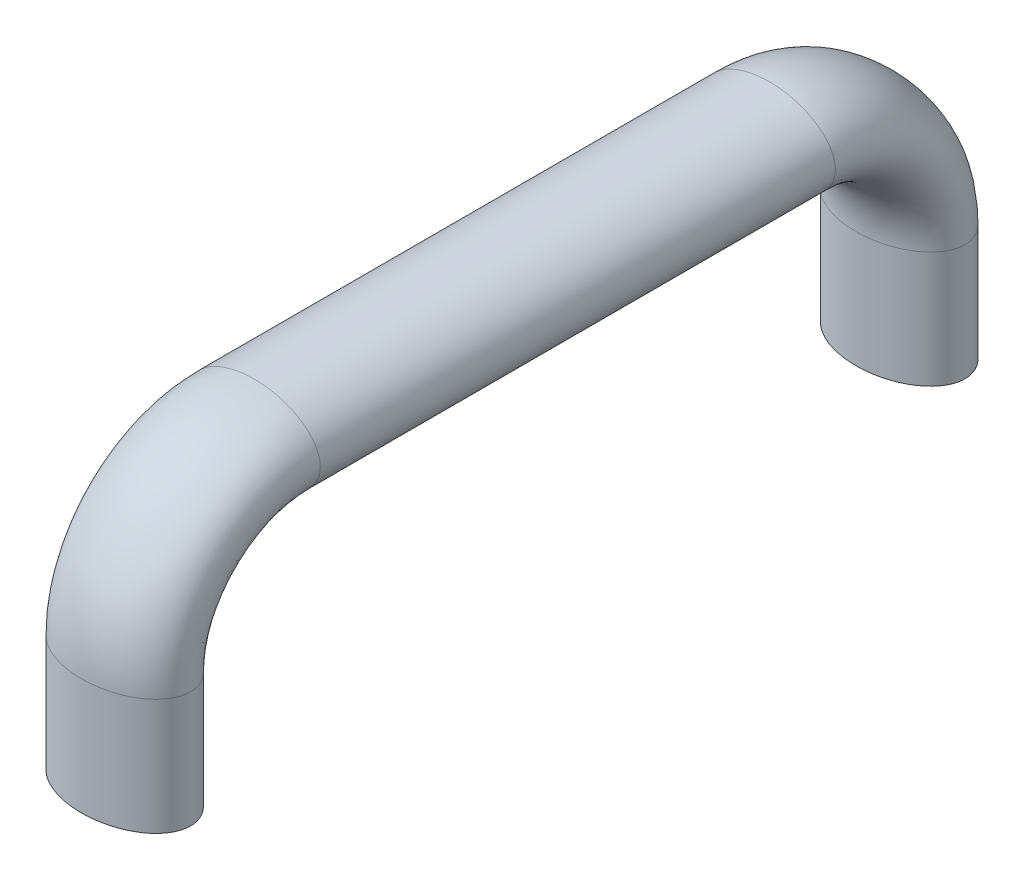
ISO-10303-21;
HEADER;
FILE_DESCRIPTION(('STEP AP214'),'2;1');
FILE_NAME('part.step','',(''),(''),'','','');
FILE_SCHEMA(('AUTOMOTIVE_DESIGN { 1 0 10303 214 1 1 1 1 }'));
ENDSEC;
DATA;
#1=APPLICATION_CONTEXT('core data for automotive mechanical design processes');
#2=APPLICATION_PROTOCOL_DEFINITION('international standard','automotive_design',2000,#1);
#3=PRODUCT_CONTEXT('',#1,'mechanical');
#4=PRODUCT('Part','Part','',(#3));
#5=PRODUCT_RELATED_PRODUCT_CATEGORY('part','',(#4));
#6=PRODUCT_DEFINITION_FORMATION('','',#4);
#7=PRODUCT_DEFINITION_CONTEXT('part definition',#1,'design');
#8=PRODUCT_DEFINITION('design','',#6,#7);
#9=PRODUCT_DEFINITION_SHAPE('','',#8);
#10=(LENGTH_UNIT() NAMED_UNIT(*) SI_UNIT(.MILLI.,.METRE.));
#11=(NAMED_UNIT(*) PLANE_ANGLE_UNIT() SI_UNIT($,.RADIAN.));
#12=(NAMED_UNIT(*) SI_UNIT($,.STERADIAN.) SOLID_ANGLE_UNIT());
#13=UNCERTAINTY_MEASURE_WITH_UNIT(LENGTH_MEASURE(1.E-05),#10,'distance_accuracy_value','');
#14=(GEOMETRIC_REPRESENTATION_CONTEXT(3) GLOBAL_UNCERTAINTY_ASSIGNED_CONTEXT((#13)) GLOBAL_UNIT_ASSIGNED_CONTEXT((#10,
#11,#12)) REPRESENTATION_CONTEXT('',''));
#15=CARTESIAN_POINT('',(0.,0.,0.));
#16=DIRECTION('',(0.,0.,1.));
#17=DIRECTION('',(1.,0.,0.));
#18=AXIS2_PLACEMENT_3D('',#15,#16,#17);
#19=CARTESIAN_POINT('',(0.,48.387,-110.109));
#20=DIRECTION('',(0.,0.,1.));
#21=DIRECTION('',(1.,0.,0.));
#22=AXIS2_PLACEMENT_3D('',#19,#20,#21);
#23=ELLIPSE('',#22,12.954,8.509);
#24=DIRECTION('',(0.,0.,1.));
#25=VECTOR('',#24,1.);
#26=SURFACE_OF_LINEAR_EXTRUSION('',#23,#25);
#27=CARTESIAN_POINT('',(0.,48.387,30.861));
#28=DIRECTION('',(0.,0.,1.));
#29=DIRECTION('',(1.,0.,0.));
#30=AXIS2_PLACEMENT_3D('',#27,#28,#29);
#31=ELLIPSE('',#30,12.954,8.509);
#32=CARTESIAN_POINT('',(12.954,48.387,30.861));
#33=VERTEX_POINT('',#32);
#34=EDGE_CURVE('E82',#33,#33,#31,.T.);
#35=ORIENTED_EDGE('',*,*,#34,.F.);
#36=EDGE_LOOP('',(#35));
#37=FACE_BOUND('',#36,.T.);
#38=CARTESIAN_POINT('',(0.,48.387,-70.485));
#39=DIRECTION('',(0.,0.,1.));
#40=DIRECTION('',(1.,0.,0.));
#41=AXIS2_PLACEMENT_3D('',#38,#39,#40);
#42=ELLIPSE('',#41,12.954,8.509);
#43=CARTESIAN_POINT('',(12.954,48.387,-70.485));
#44=VERTEX_POINT('',#43);
#45=EDGE_CURVE('E85',#44,#44,#42,.T.);
#46=ORIENTED_EDGE('',*,*,#45,.T.);
#47=EDGE_LOOP('',(#46));
#48=FACE_BOUND('',#47,.T.);
#49=ADVANCED_FACE('F40',(#37,#48),#26,.T.);
#50=CARTESIAN_POINT('',(0.,0.,56.388));
#51=DIRECTION('',(0.,-1.,0.));
#52=DIRECTION('',(0.,0.,-1.));
#53=AXIS2_PLACEMENT_3D('',#50,#51,#52);
#54=PLANE('',#53);
#55=CARTESIAN_POINT('',(0.,0.,56.388));
#56=DIRECTION('',(0.,-1.,0.));
#57=DIRECTION('',(1.,0.,0.));
#58=AXIS2_PLACEMENT_3D('',#55,#56,#57);
#59=ELLIPSE('',#58,12.954,8.509);
#60=CARTESIAN_POINT('',(12.954,0.,56.388));
#61=VERTEX_POINT('',#60);
#62=EDGE_CURVE('E87',#61,#61,#59,.T.);
#63=ORIENTED_EDGE('',*,*,#62,.T.);
#64=EDGE_LOOP('',(#63));
#65=FACE_BOUND('',#64,.T.);
#66=CARTESIAN_POINT('',(0.,0.,56.388));
#67=DIRECTION('',(0.,-1.,0.));
#68=DIRECTION('',(0.,0.,-1.));
#69=AXIS2_PLACEMENT_3D('',#66,#67,#68);
#70=CIRCLE('',#69,4.12750000000001);
#71=CARTESIAN_POINT('',(0.,0.,52.2605));
#72=VERTEX_POINT('',#71);
#73=EDGE_CURVE('E127',#72,#72,#70,.T.);
#74=ORIENTED_EDGE('',*,*,#73,.F.);
#75=EDGE_LOOP('',(#74));
#76=FACE_BOUND('',#75,.T.);
#77=ADVANCED_FACE('F71',(#65,#76),#54,.T.);
#78=CARTESIAN_POINT('',(0.,22.86,56.388));
#79=DIRECTION('',(0.,-1.,0.));
#80=DIRECTION('',(1.,0.,0.));
#81=AXIS2_PLACEMENT_3D('',#78,#79,#80);
#82=ELLIPSE('',#81,12.954,8.509);
#83=DIRECTION('',(0.,-1.,0.));
#84=VECTOR('',#83,1.);
#85=SURFACE_OF_LINEAR_EXTRUSION('',#82,#84);
#86=CARTESIAN_POINT('',(12.954,22.86,56.388));
#87=VERTEX_POINT('',#86);
#88=EDGE_CURVE('E91',#87,#87,#82,.T.);
#89=ORIENTED_EDGE('',*,*,#88,.T.);
#90=EDGE_LOOP('',(#89));
#91=FACE_BOUND('',#90,.T.);
#92=ORIENTED_EDGE('',*,*,#62,.F.);
#93=EDGE_LOOP('',(#92));
#94=FACE_BOUND('',#93,.T.);
#95=ADVANCED_FACE('F76',(#91,#94),#85,.T.);
#96=CARTESIAN_POINT('',(0.,22.86,30.861));
#97=DIRECTION('',(1.,0.,0.));
#98=AXIS1_PLACEMENT('',#96,#97);
#99=SURFACE_OF_REVOLUTION('',#31,#98);
#100=ORIENTED_EDGE('',*,*,#34,.T.);
#101=EDGE_LOOP('',(#100));
#102=FACE_BOUND('',#101,.T.);
#103=ORIENTED_EDGE('',*,*,#88,.F.);
#104=EDGE_LOOP('',(#103));
#105=FACE_BOUND('',#104,.T.);
#106=ADVANCED_FACE('F107',(#102,#105),#99,.F.);
#107=CARTESIAN_POINT('',(0.,0.965199999999993,56.388));
#108=DIRECTION('',(0.,-1.,0.));
#109=DIRECTION('',(0.,0.,-1.));
#110=AXIS2_PLACEMENT_3D('',#107,#108,#109);
#111=CONICAL_SURFACE('',#110,3.16230000000001,0.785398163397447);
#112=ORIENTED_EDGE('',*,*,#73,.T.);
#113=EDGE_LOOP('',(#112));
#114=FACE_BOUND('',#113,.T.);
#115=CARTESIAN_POINT('',(0.,0.965199999999993,56.388));
#116=DIRECTION('',(0.,-1.,0.));
#117=DIRECTION('',(0.,0.,-1.));
#118=AXIS2_PLACEMENT_3D('',#115,#116,#117);
#119=CIRCLE('',#118,3.16230000000001);
#120=CARTESIAN_POINT('',(0.,0.965199999999993,53.2257));
#121=VERTEX_POINT('',#120);
#122=EDGE_CURVE('E48',#121,#121,#119,.T.);
#123=ORIENTED_EDGE('',*,*,#122,.F.);
#124=EDGE_LOOP('',(#123));
#125=FACE_BOUND('',#124,.T.);
#126=ADVANCED_FACE('F112',(#114,#125),#111,.F.);
#127=CARTESIAN_POINT('',(0.,-5.66593181818183,56.388));
#128=DIRECTION('',(0.,-1.,0.));
#129=DIRECTION('',(0.,0.,-1.));
#130=AXIS2_PLACEMENT_3D('',#127,#128,#129);
#131=CYLINDRICAL_SURFACE('',#130,3.16230000000001);
#132=ORIENTED_EDGE('',*,*,#122,.T.);
#133=EDGE_LOOP('',(#132));
#134=FACE_BOUND('',#133,.T.);
#135=CARTESIAN_POINT('',(0.,14.224,56.388));
#136=DIRECTION('',(0.,-1.,0.));
#137=DIRECTION('',(0.,0.,-1.));
#138=AXIS2_PLACEMENT_3D('',#135,#136,#137);
#139=CIRCLE('',#138,3.16230000000001);
#140=CARTESIAN_POINT('',(0.,14.224,53.2257));
#141=VERTEX_POINT('',#140);
#142=EDGE_CURVE('E11',#141,#141,#139,.T.);
#143=ORIENTED_EDGE('',*,*,#142,.F.);
#144=EDGE_LOOP('',(#143));
#145=FACE_BOUND('',#144,.T.);
#146=ADVANCED_FACE('F67',(#134,#145),#131,.F.);
#147=CARTESIAN_POINT('',(0.,16.1241015355509,56.388));
#148=DIRECTION('',(0.,-1.,0.));
#149=DIRECTION('',(0.,0.,-1.));
#150=AXIS2_PLACEMENT_3D('',#147,#148,#149);
#151=CONICAL_SURFACE('',#150,0.,1.02974425867665);
#152=ORIENTED_EDGE('',*,*,#142,.T.);
#153=EDGE_LOOP('',(#152));
#154=FACE_BOUND('',#153,.T.);
#155=CARTESIAN_POINT('',(0.,16.1241015355509,56.388));
#156=VERTEX_POINT('',#155);
#157=VERTEX_LOOP('',#156);
#158=FACE_BOUND('',#157,.T.);
#159=ADVANCED_FACE('F57',(#154,#158),#151,.F.);
#160=CARTESIAN_POINT('',(0.,16.1241015355509,-96.012));
#161=DIRECTION('',(0.,-1.,0.));
#162=DIRECTION('',(0.,0.,1.));
#163=AXIS2_PLACEMENT_3D('',#160,#161,#162);
#164=CONICAL_SURFACE('',#163,0.,1.02974425867665);
#165=CARTESIAN_POINT('',(0.,14.224,-96.012));
#166=DIRECTION('',(0.,1.,0.));
#167=DIRECTION('',(0.,0.,1.));
#168=AXIS2_PLACEMENT_3D('',#165,#166,#167);
#169=CIRCLE('',#168,3.16230000000001);
#170=CARTESIAN_POINT('',(0.,14.224,-92.8497));
#171=VERTEX_POINT('',#170);
#172=EDGE_CURVE('E235',#171,#171,#169,.T.);
#173=ORIENTED_EDGE('',*,*,#172,.F.);
#174=EDGE_LOOP('',(#173));
#175=FACE_BOUND('',#174,.T.);
#176=CARTESIAN_POINT('',(0.,16.1241015355509,-96.012));
#177=VERTEX_POINT('',#176);
#178=VERTEX_LOOP('',#177);
#179=FACE_BOUND('',#178,.T.);
#180=ADVANCED_FACE('F54',(#175,#179),#164,.F.);
#181=CARTESIAN_POINT('',(0.,-5.66593181818183,-96.012));
#182=DIRECTION('',(0.,-1.,0.));
#183=DIRECTION('',(0.,0.,1.));
#184=AXIS2_PLACEMENT_3D('',#181,#182,#183);
#185=CYLINDRICAL_SURFACE('',#184,3.16230000000001);
#186=CARTESIAN_POINT('',(0.,0.965199999999993,-96.012));
#187=DIRECTION('',(0.,1.,0.));
#188=DIRECTION('',(0.,0.,1.));
#189=AXIS2_PLACEMENT_3D('',#186,#187,#188);
#190=CIRCLE('',#189,3.16230000000001);
#191=CARTESIAN_POINT('',(0.,0.965199999999993,-92.8497));
#192=VERTEX_POINT('',#191);
#193=EDGE_CURVE('E230',#192,#192,#190,.T.);
#194=ORIENTED_EDGE('',*,*,#193,.F.);
#195=EDGE_LOOP('',(#194));
#196=FACE_BOUND('',#195,.T.);
#197=ORIENTED_EDGE('',*,*,#172,.T.);
#198=EDGE_LOOP('',(#197));
#199=FACE_BOUND('',#198,.T.);
#200=ADVANCED_FACE('F56',(#196,#199),#185,.F.);
#201=CARTESIAN_POINT('',(0.,0.965199999999993,-96.012));
#202=DIRECTION('',(0.,-1.,0.));
#203=DIRECTION('',(0.,0.,1.));
#204=AXIS2_PLACEMENT_3D('',#201,#202,#203);
#205=CONICAL_SURFACE('',#204,3.16230000000001,0.785398163397447);
#206=CARTESIAN_POINT('',(0.,0.,-96.012));
#207=DIRECTION('',(0.,1.,0.));
#208=DIRECTION('',(0.,0.,1.));
#209=AXIS2_PLACEMENT_3D('',#206,#207,#208);
#210=CIRCLE('',#209,4.12750000000001);
#211=CARTESIAN_POINT('',(0.,0.,-91.8845));
#212=VERTEX_POINT('',#211);
#213=EDGE_CURVE('E228',#212,#212,#210,.T.);
#214=ORIENTED_EDGE('',*,*,#213,.F.);
#215=EDGE_LOOP('',(#214));
#216=FACE_BOUND('',#215,.T.);
#217=ORIENTED_EDGE('',*,*,#193,.T.);
#218=EDGE_LOOP('',(#217));
#219=FACE_BOUND('',#218,.T.);
#220=ADVANCED_FACE('F64',(#216,#219),#205,.F.);
#221=CARTESIAN_POINT('',(0.,0.,-96.012));
#222=DIRECTION('',(0.,1.,0.));
#223=DIRECTION('',(0.,0.,1.));
#224=AXIS2_PLACEMENT_3D('',#221,#222,#223);
#225=PLANE('',#224);
#226=CARTESIAN_POINT('',(0.,0.,-96.012));
#227=DIRECTION('',(0.,1.,0.));
#228=DIRECTION('',(1.,0.,0.));
#229=AXIS2_PLACEMENT_3D('',#226,#227,#228);
#230=ELLIPSE('',#229,12.954,8.509);
#231=CARTESIAN_POINT('',(12.954,0.,-96.012));
#232=VERTEX_POINT('',#231);
#233=EDGE_CURVE('E94',#232,#232,#230,.T.);
#234=ORIENTED_EDGE('',*,*,#233,.F.);
#235=EDGE_LOOP('',(#234));
#236=FACE_BOUND('',#235,.T.);
#237=ORIENTED_EDGE('',*,*,#213,.T.);
#238=EDGE_LOOP('',(#237));
#239=FACE_BOUND('',#238,.T.);
#240=ADVANCED_FACE('F189',(#236,#239),#225,.F.);
#241=CARTESIAN_POINT('',(0.,22.86,-96.012));
#242=DIRECTION('',(0.,1.,0.));
#243=DIRECTION('',(1.,0.,0.));
#244=AXIS2_PLACEMENT_3D('',#241,#242,#243);
#245=ELLIPSE('',#244,12.954,8.509);
#246=DIRECTION('',(0.,-1.,0.));
#247=VECTOR('',#246,1.);
#248=SURFACE_OF_LINEAR_EXTRUSION('',#245,#247);
#249=CARTESIAN_POINT('',(12.954,22.86,-96.012));
#250=VERTEX_POINT('',#249);
#251=EDGE_CURVE('E88',#250,#250,#245,.T.);
#252=ORIENTED_EDGE('',*,*,#251,.F.);
#253=EDGE_LOOP('',(#252));
#254=FACE_BOUND('',#253,.T.);
#255=ORIENTED_EDGE('',*,*,#233,.T.);
#256=EDGE_LOOP('',(#255));
#257=FACE_BOUND('',#256,.T.);
#258=ADVANCED_FACE('F199',(#254,#257),#248,.F.);
#259=CARTESIAN_POINT('',(0.,22.86,-70.485));
#260=DIRECTION('',(1.,0.,0.));
#261=AXIS1_PLACEMENT('',#259,#260);
#262=SURFACE_OF_REVOLUTION('',#245,#261);
#263=ORIENTED_EDGE('',*,*,#251,.T.);
#264=EDGE_LOOP('',(#263));
#265=FACE_BOUND('',#264,.T.);
#266=ORIENTED_EDGE('',*,*,#45,.F.);
#267=EDGE_LOOP('',(#266));
#268=FACE_BOUND('',#267,.T.);
#269=ADVANCED_FACE('F109',(#265,#268),#262,.F.);
#270=CLOSED_SHELL('',(#49,#77,#95,#106,#126,#146,#159,#180,#200,#220,#240,#258,#269));
#271=MANIFOLD_SOLID_BREP('B2',#270);
#272=ADVANCED_BREP_SHAPE_REPRESENTATION('',(#18,#271),#14);
#273=SHAPE_DEFINITION_REPRESENTATION(#9,#272);
ENDSEC;
END-ISO-10303-21;
